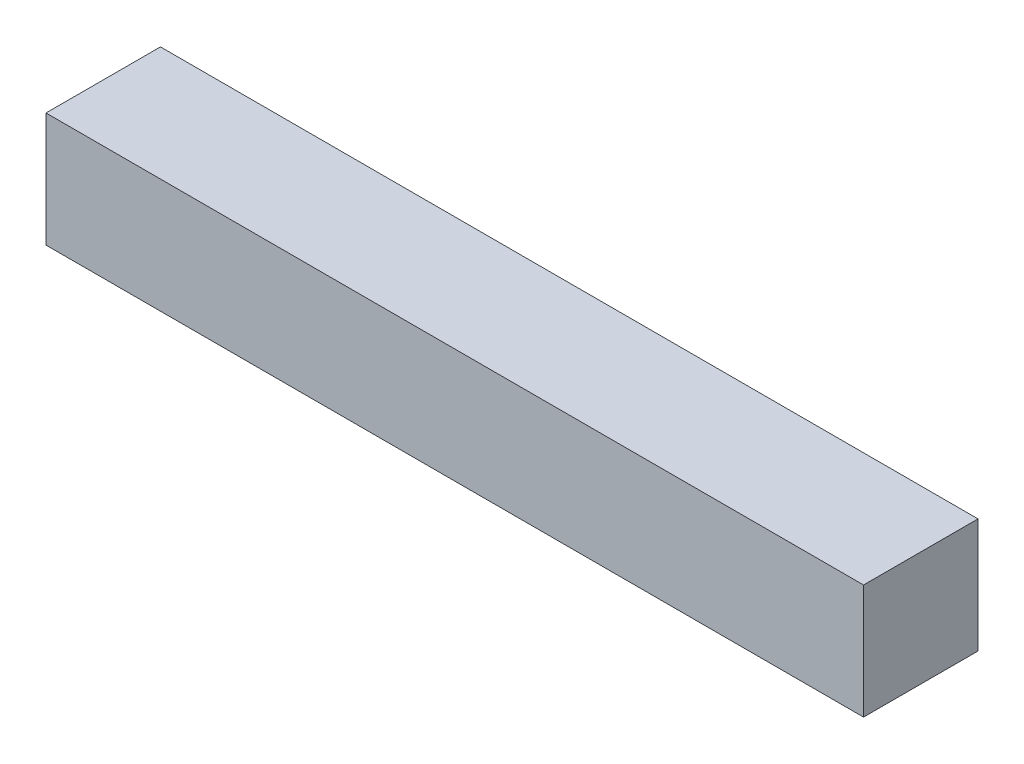
ISO-10303-21;
HEADER;
FILE_DESCRIPTION(('STEP AP214'),'2;1');
FILE_NAME('part.step','',(''),(''),'','','');
FILE_SCHEMA(('AUTOMOTIVE_DESIGN { 1 0 10303 214 1 1 1 1 }'));
ENDSEC;
DATA;
#1=APPLICATION_CONTEXT('core data for automotive mechanical design processes');
#2=APPLICATION_PROTOCOL_DEFINITION('international standard','automotive_design',2000,#1);
#3=PRODUCT_CONTEXT('',#1,'mechanical');
#4=PRODUCT('Part','Part','',(#3));
#5=PRODUCT_RELATED_PRODUCT_CATEGORY('part','',(#4));
#6=PRODUCT_DEFINITION_FORMATION('','',#4);
#7=PRODUCT_DEFINITION_CONTEXT('part definition',#1,'design');
#8=PRODUCT_DEFINITION('design','',#6,#7);
#9=PRODUCT_DEFINITION_SHAPE('','',#8);
#10=(LENGTH_UNIT() NAMED_UNIT(*) SI_UNIT(.MILLI.,.METRE.));
#11=(NAMED_UNIT(*) PLANE_ANGLE_UNIT() SI_UNIT($,.RADIAN.));
#12=(NAMED_UNIT(*) SI_UNIT($,.STERADIAN.) SOLID_ANGLE_UNIT());
#13=UNCERTAINTY_MEASURE_WITH_UNIT(LENGTH_MEASURE(1.E-05),#10,'distance_accuracy_value','');
#14=(GEOMETRIC_REPRESENTATION_CONTEXT(3) GLOBAL_UNCERTAINTY_ASSIGNED_CONTEXT((#13)) GLOBAL_UNIT_ASSIGNED_CONTEXT((#10,
#11,#12)) REPRESENTATION_CONTEXT('',''));
#15=CARTESIAN_POINT('',(0.,0.,0.));
#16=DIRECTION('',(0.,0.,1.));
#17=DIRECTION('',(1.,0.,0.));
#18=AXIS2_PLACEMENT_3D('',#15,#16,#17);
#19=CARTESIAN_POINT('',(0.,0.,0.));
#20=DIRECTION('',(0.,0.,1.));
#21=DIRECTION('',(1.,0.,0.));
#22=AXIS2_PLACEMENT_3D('',#19,#20,#21);
#23=PLANE('',#22);
#24=DIRECTION('',(0.,-1.,0.));
#25=VECTOR('',#24,1.);
#26=CARTESIAN_POINT('',(-15000.,7000.,0.));
#27=LINE('',#26,#25);
#28=CARTESIAN_POINT('',(-15000.,7000.,0.));
#29=VERTEX_POINT('',#28);
#30=CARTESIAN_POINT('',(-15000.,0.,0.));
#31=VERTEX_POINT('',#30);
#32=EDGE_CURVE('E343',#29,#31,#27,.T.);
#33=ORIENTED_EDGE('',*,*,#32,.F.);
#34=DIRECTION('',(-1.,0.,0.));
#35=VECTOR('',#34,1.);
#36=CARTESIAN_POINT('',(35000.,7000.,0.));
#37=LINE('',#36,#35);
#38=CARTESIAN_POINT('',(35000.,7000.,0.));
#39=VERTEX_POINT('',#38);
#40=EDGE_CURVE('E95',#39,#29,#37,.T.);
#41=ORIENTED_EDGE('',*,*,#40,.F.);
#42=DIRECTION('',(0.,1.,0.));
#43=VECTOR('',#42,1.);
#44=CARTESIAN_POINT('',(35000.,0.,0.));
#45=LINE('',#44,#43);
#46=CARTESIAN_POINT('',(35000.,0.,0.));
#47=VERTEX_POINT('',#46);
#48=EDGE_CURVE('E338',#47,#39,#45,.T.);
#49=ORIENTED_EDGE('',*,*,#48,.F.);
#50=DIRECTION('',(1.,0.,0.));
#51=VECTOR('',#50,1.);
#52=CARTESIAN_POINT('',(-15000.,0.,0.));
#53=LINE('',#52,#51);
#54=EDGE_CURVE('E335',#31,#47,#53,.T.);
#55=ORIENTED_EDGE('',*,*,#54,.F.);
#56=EDGE_LOOP('',(#33,#41,#49,#55));
#57=FACE_BOUND('',#56,.T.);
#58=DIRECTION('',(0.,-1.,0.));
#59=VECTOR('',#58,1.);
#60=CARTESIAN_POINT('',(99.9066587836865,800.,0.));
#61=LINE('',#60,#59);
#62=CARTESIAN_POINT('',(99.9066587836865,158.611679528378,0.));
#63=VERTEX_POINT('',#62);
#64=CARTESIAN_POINT('',(99.9066587836865,474.242430461089,0.));
#65=VERTEX_POINT('',#64);
#66=EDGE_CURVE('E11',#63,#65,#61,.F.);
#67=ORIENTED_EDGE('',*,*,#66,.F.);
#68=CARTESIAN_POINT('',(150.,300.,0.));
#69=DIRECTION('',(0.,0.,1.));
#70=DIRECTION('',(1.,0.,0.));
#71=AXIS2_PLACEMENT_3D('',#68,#69,#70);
#72=CIRCLE('',#71,150.);
#73=CARTESIAN_POINT('',(150.,150.,0.));
#74=VERTEX_POINT('',#73);
#75=EDGE_CURVE('E376',#63,#74,#72,.T.);
#76=ORIENTED_EDGE('',*,*,#75,.T.);
#77=DIRECTION('',(1.,0.,0.));
#78=VECTOR('',#77,1.);
#79=CARTESIAN_POINT('',(0.,150.,0.));
#80=LINE('',#79,#78);
#81=CARTESIAN_POINT('',(2301.451,150.,0.));
#82=VERTEX_POINT('',#81);
#83=EDGE_CURVE('E369',#74,#82,#80,.T.);
#84=ORIENTED_EDGE('',*,*,#83,.T.);
#85=DIRECTION('',(0.999048223992947,0.0436193321422773,0.));
#86=VECTOR('',#85,1.);
#87=CARTESIAN_POINT('',(-2.15782559269287,49.4223941585042,0.));
#88=LINE('',#87,#86);
#89=CARTESIAN_POINT('',(4876.20515246235,262.416051461552,0.));
#90=VERTEX_POINT('',#89);
#91=EDGE_CURVE('E368',#82,#90,#88,.T.);
#92=ORIENTED_EDGE('',*,*,#91,.T.);
#93=DIRECTION('',(0.,-1.,0.));
#94=VECTOR('',#93,1.);
#95=CARTESIAN_POINT('',(4876.20515246235,800.,0.));
#96=LINE('',#95,#94);
#97=CARTESIAN_POINT('',(4876.20515246235,300.968653089973,0.));
#98=VERTEX_POINT('',#97);
#99=EDGE_CURVE('E365',#98,#90,#96,.T.);
#100=ORIENTED_EDGE('',*,*,#99,.F.);
#101=DIRECTION('',(-0.985279818521785,0.170949346923816,0.));
#102=VECTOR('',#101,1.);
#103=CARTESIAN_POINT('',(193.193690698954,1113.48681897129,0.));
#104=LINE('',#103,#102);
#105=CARTESIAN_POINT('',(2197.056,765.81,0.));
#106=VERTEX_POINT('',#105);
#107=EDGE_CURVE('E358',#98,#106,#104,.T.);
#108=ORIENTED_EDGE('',*,*,#107,.T.);
#109=DIRECTION('',(-0.996313130885577,0.0857912887476274,0.));
#110=VECTOR('',#109,1.);
#111=CARTESIAN_POINT('',(81.6282514008476,947.96686131076,0.));
#112=LINE('',#111,#110);
#113=CARTESIAN_POINT('',(1800.,800.,0.));
#114=VERTEX_POINT('',#113);
#115=EDGE_CURVE('E357',#106,#114,#112,.T.);
#116=ORIENTED_EDGE('',*,*,#115,.T.);
#117=DIRECTION('',(1.,0.,0.));
#118=VECTOR('',#117,1.);
#119=CARTESIAN_POINT('',(0.,800.,0.));
#120=LINE('',#119,#118);
#121=CARTESIAN_POINT('',(1551.451,800.,0.));
#122=VERTEX_POINT('',#121);
#123=EDGE_CURVE('E362',#122,#114,#120,.T.);
#124=ORIENTED_EDGE('',*,*,#123,.F.);
#125=DIRECTION('',(-0.992522376322293,-0.122062821938327,0.));
#126=VECTOR('',#125,1.);
#127=CARTESIAN_POINT('',(-73.8044813669109,600.122117990456,0.));
#128=LINE('',#127,#126);
#129=CARTESIAN_POINT('',(1255.921,763.655,0.));
#130=VERTEX_POINT('',#129);
#131=EDGE_CURVE('E203',#122,#130,#128,.T.);
#132=ORIENTED_EDGE('',*,*,#131,.T.);
#133=DIRECTION('',(-0.970201590454346,-0.242299141310607,0.));
#134=VECTOR('',#133,1.);
#135=CARTESIAN_POINT('',(-105.785555519373,423.581006754064,0.));
#136=LINE('',#135,#134);
#137=CARTESIAN_POINT('',(113.655128803409,478.384348557619,0.));
#138=VERTEX_POINT('',#137);
#139=EDGE_CURVE('E373',#130,#138,#136,.T.);
#140=ORIENTED_EDGE('',*,*,#139,.T.);
#141=CARTESIAN_POINT('',(150.,332.854109989467,0.));
#142=DIRECTION('',(0.,0.,1.));
#143=DIRECTION('',(1.,0.,0.));
#144=AXIS2_PLACEMENT_3D('',#141,#142,#143);
#145=CIRCLE('',#144,150.);
#146=EDGE_CURVE('E54',#138,#65,#145,.T.);
#147=ORIENTED_EDGE('',*,*,#146,.T.);
#148=EDGE_LOOP('',(#67,#76,#84,#92,#100,#108,#116,#124,#132,#140,#147));
#149=FACE_BOUND('',#148,.T.);
#150=ADVANCED_FACE('F50',(#57,#149),#23,.F.);
#151=CARTESIAN_POINT('',(-15000.,7000.,7000.));
#152=DIRECTION('',(1.,0.,0.));
#153=DIRECTION('',(0.,0.,-1.));
#154=AXIS2_PLACEMENT_3D('',#151,#152,#153);
#155=PLANE('',#154);
#156=ORIENTED_EDGE('',*,*,#32,.T.);
#157=DIRECTION('',(0.,0.,-1.));
#158=VECTOR('',#157,1.);
#159=CARTESIAN_POINT('',(-15000.,0.,7000.));
#160=LINE('',#159,#158);
#161=CARTESIAN_POINT('',(-15000.,0.,7000.));
#162=VERTEX_POINT('',#161);
#163=EDGE_CURVE('E340',#162,#31,#160,.T.);
#164=ORIENTED_EDGE('',*,*,#163,.F.);
#165=DIRECTION('',(0.,-1.,0.));
#166=VECTOR('',#165,1.);
#167=CARTESIAN_POINT('',(-15000.,7000.,7000.));
#168=LINE('',#167,#166);
#169=CARTESIAN_POINT('',(-15000.,7000.,7000.));
#170=VERTEX_POINT('',#169);
#171=EDGE_CURVE('E346',#170,#162,#168,.T.);
#172=ORIENTED_EDGE('',*,*,#171,.F.);
#173=DIRECTION('',(0.,0.,-1.));
#174=VECTOR('',#173,1.);
#175=CARTESIAN_POINT('',(-15000.,7000.,7000.));
#176=LINE('',#175,#174);
#177=EDGE_CURVE('E355',#170,#29,#176,.T.);
#178=ORIENTED_EDGE('',*,*,#177,.T.);
#179=EDGE_LOOP('',(#156,#164,#172,#178));
#180=FACE_BOUND('',#179,.T.);
#181=ADVANCED_FACE('F47',(#180),#155,.F.);
#182=CARTESIAN_POINT('',(-15000.,0.,7000.));
#183=DIRECTION('',(0.,1.,0.));
#184=DIRECTION('',(0.,0.,1.));
#185=AXIS2_PLACEMENT_3D('',#182,#183,#184);
#186=PLANE('',#185);
#187=ORIENTED_EDGE('',*,*,#54,.T.);
#188=DIRECTION('',(0.,0.,-1.));
#189=VECTOR('',#188,1.);
#190=CARTESIAN_POINT('',(35000.,0.,7000.));
#191=LINE('',#190,#189);
#192=CARTESIAN_POINT('',(35000.,0.,7000.));
#193=VERTEX_POINT('',#192);
#194=EDGE_CURVE('E331',#193,#47,#191,.T.);
#195=ORIENTED_EDGE('',*,*,#194,.F.);
#196=DIRECTION('',(1.,0.,0.));
#197=VECTOR('',#196,1.);
#198=CARTESIAN_POINT('',(-15000.,0.,7000.));
#199=LINE('',#198,#197);
#200=EDGE_CURVE('E99',#162,#193,#199,.T.);
#201=ORIENTED_EDGE('',*,*,#200,.F.);
#202=ORIENTED_EDGE('',*,*,#163,.T.);
#203=EDGE_LOOP('',(#187,#195,#201,#202));
#204=FACE_BOUND('',#203,.T.);
#205=ADVANCED_FACE('F320',(#204),#186,.F.);
#206=CARTESIAN_POINT('',(35000.,0.,7000.));
#207=DIRECTION('',(-1.,0.,0.));
#208=DIRECTION('',(0.,0.,1.));
#209=AXIS2_PLACEMENT_3D('',#206,#207,#208);
#210=PLANE('',#209);
#211=ORIENTED_EDGE('',*,*,#48,.T.);
#212=DIRECTION('',(0.,0.,-1.));
#213=VECTOR('',#212,1.);
#214=CARTESIAN_POINT('',(35000.,7000.,7000.));
#215=LINE('',#214,#213);
#216=CARTESIAN_POINT('',(35000.,7000.,7000.));
#217=VERTEX_POINT('',#216);
#218=EDGE_CURVE('E344',#217,#39,#215,.T.);
#219=ORIENTED_EDGE('',*,*,#218,.F.);
#220=DIRECTION('',(0.,1.,0.));
#221=VECTOR('',#220,1.);
#222=CARTESIAN_POINT('',(35000.,0.,7000.));
#223=LINE('',#222,#221);
#224=EDGE_CURVE('E342',#193,#217,#223,.T.);
#225=ORIENTED_EDGE('',*,*,#224,.F.);
#226=ORIENTED_EDGE('',*,*,#194,.T.);
#227=EDGE_LOOP('',(#211,#219,#225,#226));
#228=FACE_BOUND('',#227,.T.);
#229=ADVANCED_FACE('F326',(#228),#210,.F.);
#230=CARTESIAN_POINT('',(35000.,7000.,7000.));
#231=DIRECTION('',(0.,-1.,0.));
#232=DIRECTION('',(0.,0.,-1.));
#233=AXIS2_PLACEMENT_3D('',#230,#231,#232);
#234=PLANE('',#233);
#235=ORIENTED_EDGE('',*,*,#40,.T.);
#236=ORIENTED_EDGE('',*,*,#177,.F.);
#237=DIRECTION('',(-1.,0.,0.));
#238=VECTOR('',#237,1.);
#239=CARTESIAN_POINT('',(35000.,7000.,7000.));
#240=LINE('',#239,#238);
#241=EDGE_CURVE('E72',#217,#170,#240,.T.);
#242=ORIENTED_EDGE('',*,*,#241,.F.);
#243=ORIENTED_EDGE('',*,*,#218,.T.);
#244=EDGE_LOOP('',(#235,#236,#242,#243));
#245=FACE_BOUND('',#244,.T.);
#246=ADVANCED_FACE('F323',(#245),#234,.F.);
#247=CARTESIAN_POINT('',(0.,0.,7000.));
#248=DIRECTION('',(0.,0.,1.));
#249=DIRECTION('',(1.,0.,0.));
#250=AXIS2_PLACEMENT_3D('',#247,#248,#249);
#251=PLANE('',#250);
#252=ORIENTED_EDGE('',*,*,#171,.T.);
#253=ORIENTED_EDGE('',*,*,#200,.T.);
#254=ORIENTED_EDGE('',*,*,#224,.T.);
#255=ORIENTED_EDGE('',*,*,#241,.T.);
#256=EDGE_LOOP('',(#252,#253,#254,#255));
#257=FACE_BOUND('',#256,.T.);
#258=ADVANCED_FACE('F325',(#257),#251,.T.);
#259=CARTESIAN_POINT('',(259.906658783687,800.,0.));
#260=DIRECTION('',(0.,-1.,0.));
#261=DIRECTION('',(0.,0.,-1.));
#262=AXIS2_PLACEMENT_3D('',#259,#260,#261);
#263=CYLINDRICAL_SURFACE('',#262,160.);
#264=ORIENTED_EDGE('',*,*,#66,.T.);
#265=CARTESIAN_POINT('',(113.655128803409,478.384348557619,-64.8882884535263));
#266=CARTESIAN_POINT('',(112.773939032918,478.164232994411,-62.9022135519065));
#267=CARTESIAN_POINT('',(111.933155729284,477.945795953748,-60.8980057661391));
#268=CARTESIAN_POINT('',(110.333625202495,477.516710712539,-56.8562236105316));
#269=CARTESIAN_POINT('',(109.574880662755,477.306062766917,-54.8186481517733));
#270=CARTESIAN_POINT('',(108.140474526136,476.896935722458,-50.7124900371555));
#271=CARTESIAN_POINT('',(107.464840130629,476.698460618308,-48.6438974768202));
#272=CARTESIAN_POINT('',(106.198137658814,476.317814583302,-44.4795123289952));
#273=CARTESIAN_POINT('',(105.607068680471,476.135643478542,-42.383720031898));
#274=CARTESIAN_POINT('',(104.511164120193,475.791492586405,-38.170326894472));
#275=CARTESIAN_POINT('',(104.006242210099,475.629492630005,-36.0527501682852));
#276=CARTESIAN_POINT('',(103.082932209994,475.328755377082,-31.7971598743901));
#277=CARTESIAN_POINT('',(102.66454431668,475.190018133439,-29.6591462602389));
#278=CARTESIAN_POINT('',(101.915268820844,474.938644041753,-25.3666448290491));
#279=CARTESIAN_POINT('',(101.58436782491,474.826003198927,-23.2121595856826));
#280=CARTESIAN_POINT('',(101.010740244002,474.629088177567,-18.8901866979926));
#281=CARTESIAN_POINT('',(100.768013552683,474.544813964819,-16.7226990693543));
#282=CARTESIAN_POINT('',(100.37076423608,474.406161867699,-12.3726224328995));
#283=CARTESIAN_POINT('',(100.21648827366,474.351867603903,-10.1900082088244));
#284=CARTESIAN_POINT('',(99.9975671230742,474.274653761924,-5.8197269539753));
#285=CARTESIAN_POINT('',(99.9329221235669,474.251734249778,-3.6320599125758));
#286=CARTESIAN_POINT('',(99.8934242819721,474.237742403755,0.744450738233998));
#287=CARTESIAN_POINT('',(99.9185822486834,474.246673903504,2.93329445756778));
#288=CARTESIAN_POINT('',(100.058650209219,474.296207977458,7.30773390133307));
#289=CARTESIAN_POINT('',(100.173559683034,474.336810368165,9.49332964450949));
#290=CARTESIAN_POINT('',(100.492693380218,474.448796061191,13.8551440212282));
#291=CARTESIAN_POINT('',(100.696834271621,474.520150643601,16.0313694952312));
#292=CARTESIAN_POINT('',(101.193919943739,474.692171407193,20.3725274347643));
#293=CARTESIAN_POINT('',(101.486866629951,474.792838217323,22.5374596569623));
#294=CARTESIAN_POINT('',(102.16078590948,475.021392150112,26.8515295793954));
#295=CARTESIAN_POINT('',(102.541734866669,475.149271963028,29.0006713610749));
#296=CARTESIAN_POINT('',(103.390811659426,475.429645345374,33.2798357862657));
#297=CARTESIAN_POINT('',(103.8589325439,475.582136952128,35.4098599400322));
#298=CARTESIAN_POINT('',(104.936939869616,475.926381416005,39.8776210107061));
#299=CARTESIAN_POINT('',(105.556701493798,476.120599632764,42.2127912998076));
#300=CARTESIAN_POINT('',(106.900536974426,476.5305848942,46.8503359801782));
#301=CARTESIAN_POINT('',(107.624586121608,476.746346830732,49.1527179985066));
#302=CARTESIAN_POINT('',(109.174416422244,477.193713901137,53.7177097487012));
#303=CARTESIAN_POINT('',(110.000046911566,477.425295350108,55.9803728286771));
#304=CARTESIAN_POINT('',(111.314153213711,477.78033591011,59.3440574899915));
#305=CARTESIAN_POINT('',(111.764862264654,477.899976882307,60.4603772225236));
#306=CARTESIAN_POINT('',(112.691287391964,478.141029180627,62.6823991134769));
#307=CARTESIAN_POINT('',(113.167003475438,478.262440507252,63.7881012688804));
#308=CARTESIAN_POINT('',(113.655128803409,478.384348557619,64.8882884535263));
#309=B_SPLINE_CURVE_WITH_KNOTS('',3,(#265,#266,#267,#268,#269,#270,#271,#272,#273,#274,#275,
#276,#277,#278,#279,#280,#281,#282,#283,#284,#285,#286,#287,#288,#289,#290,#291,#292,#293,#294,
#295,#296,#297,#298,#299,#300,#301,#302,#303,#304,#305,#306,#307,#308),.UNSPECIFIED.,.F.,.F.,(4,
2,2,2,2,2,2,2,2,2,2,2,2,2,2,2,2,2,2,2,2,4),(0.,6.55129299468972,13.1028002115112,
19.6564460177392,26.2100219127685,32.7569913826109,39.3039757340479,45.849957223369,
52.3959308176641,58.9600714939326,65.5242259865694,72.089170575798,78.6540771287231,
85.2128658627705,91.7717953380148,98.3289652243589,104.885612465355,112.154383970393,
119.421436080517,126.677836867381,130.306981102657,133.936126369311),.UNSPECIFIED.);
#310=CARTESIAN_POINT('',(113.655128803409,478.384348557619,64.8882884535251));
#311=VERTEX_POINT('',#310);
#312=EDGE_CURVE('E243',#65,#311,#309,.T.);
#313=ORIENTED_EDGE('',*,*,#312,.T.);
#314=CARTESIAN_POINT('',(259.906658783687,514.909355812027,0.));
#315=DIRECTION('',(-0.242299141310607,0.970201590454346,0.));
#316=DIRECTION('',(-0.970201590454346,-0.242299141310607,0.));
#317=AXIS2_PLACEMENT_3D('',#314,#315,#316);
#318=ELLIPSE('',#317,164.914180283988,160.);
#319=CARTESIAN_POINT('',(161.409759474517,490.310639051325,126.088702215857));
#320=VERTEX_POINT('',#319);
#321=EDGE_CURVE('E384',#311,#320,#318,.T.);
#322=ORIENTED_EDGE('',*,*,#321,.T.);
#323=DIRECTION('',(0.,-1.,0.));
#324=VECTOR('',#323,1.);
#325=CARTESIAN_POINT('',(161.409759474516,800.,126.088702215857));
#326=LINE('',#325,#324);
#327=CARTESIAN_POINT('',(161.409759474516,150.,126.088702215857));
#328=VERTEX_POINT('',#327);
#329=EDGE_CURVE('E245',#320,#328,#326,.T.);
#330=ORIENTED_EDGE('',*,*,#329,.T.);
#331=CARTESIAN_POINT('',(259.906658783687,150.,0.));
#332=DIRECTION('',(0.,-1.,0.));
#333=DIRECTION('',(0.,0.,-1.));
#334=AXIS2_PLACEMENT_3D('',#331,#332,#333);
#335=CIRCLE('',#334,160.);
#336=CARTESIAN_POINT('',(150.,150.,116.277798203296));
#337=VERTEX_POINT('',#336);
#338=EDGE_CURVE('E401',#328,#337,#335,.T.);
#339=ORIENTED_EDGE('',*,*,#338,.T.);
#340=CARTESIAN_POINT('',(150.,150.,116.277798203296));
#341=CARTESIAN_POINT('',(149.197227518988,150.000000444739,115.519013001234));
#342=CARTESIAN_POINT('',(148.402349323817,150.006444551494,114.751945115754));
#343=CARTESIAN_POINT('',(146.828761077162,150.031461689993,113.201629596887));
#344=CARTESIAN_POINT('',(146.050050642098,150.050034433644,112.418382348238));
#345=CARTESIAN_POINT('',(143.738992605803,150.122798834219,110.045212540939));
#346=CARTESIAN_POINT('',(142.231396084721,150.194037269926,108.43155736251));
#347=CARTESIAN_POINT('',(139.286546373212,150.375814699117,105.145862331909));
#348=CARTESIAN_POINT('',(137.849239225862,150.486322991144,103.473869007217));
#349=CARTESIAN_POINT('',(135.046053340973,150.740627964951,100.073395601841));
#350=CARTESIAN_POINT('',(133.68017721911,150.884425864692,98.3449134563993));
#351=CARTESIAN_POINT('',(131.023003065829,151.199252798717,94.8358771461094));
#352=CARTESIAN_POINT('',(129.731654200361,151.37026296545,93.0553597529595));
#353=CARTESIAN_POINT('',(127.224251842487,151.733785604688,89.4439038255723));
#354=CARTESIAN_POINT('',(126.008207640174,151.926300722009,87.6129591103741));
#355=CARTESIAN_POINT('',(123.653075843413,152.327163170553,83.903449669022));
#356=CARTESIAN_POINT('',(122.514002675644,152.535513454298,82.0248761060328));
#357=CARTESIAN_POINT('',(120.314753352958,152.962451132073,78.2235331504458));
#358=CARTESIAN_POINT('',(119.254568306852,153.181037367909,76.3007687705009));
#359=CARTESIAN_POINT('',(117.216364660646,153.622684269366,72.4173979297617));
#360=CARTESIAN_POINT('',(116.238193444443,153.84573562226,70.4568704991598));
#361=CARTESIAN_POINT('',(114.363161419552,154.291577394139,66.4972847107507));
#362=CARTESIAN_POINT('',(113.466300511938,154.514367813441,64.4982263998262));
#363=CARTESIAN_POINT('',(111.755279479412,154.954759642745,60.464600680722));
#364=CARTESIAN_POINT('',(110.941114441265,155.172361360436,58.4300353905561));
#365=CARTESIAN_POINT('',(109.396721623774,155.597730716471,54.3282724139933));
#366=CARTESIAN_POINT('',(108.666493845211,155.805498354724,52.2610747272926));
#367=CARTESIAN_POINT('',(107.291517437633,156.206751675774,48.0980446572108));
#368=CARTESIAN_POINT('',(106.646732773703,156.400243363975,46.0022247590141));
#369=CARTESIAN_POINT('',(105.443470641596,156.769026649784,41.784363149105));
#370=CARTESIAN_POINT('',(104.884993033115,156.944318276979,39.6623214800257));
#371=CARTESIAN_POINT('',(103.855447732851,157.273084547455,35.3954250788466));
#372=CARTESIAN_POINT('',(103.384381074604,157.426558932767,33.2505700773215));
#373=CARTESIAN_POINT('',(102.530668116976,157.708522147084,28.9416891731522));
#374=CARTESIAN_POINT('',(102.148022100941,157.837010896023,26.7776632090972));
#375=CARTESIAN_POINT('',(101.465667462759,158.068499170636,22.3934355301932));
#376=CARTESIAN_POINT('',(101.16765188495,158.170974528566,20.1729421971747));
#377=CARTESIAN_POINT('',(100.665032437988,158.345025688778,15.7201891996206));
#378=CARTESIAN_POINT('',(100.460428869546,158.416601391587,13.4879294972302));
#379=CARTESIAN_POINT('',(100.145158117363,158.527307591484,9.01595322708888));
#380=CARTESIAN_POINT('',(100.034491923749,158.566437746585,6.77623658098935));
#381=CARTESIAN_POINT('',(99.9073913706489,158.611403854638,2.29379848782876));
#382=CARTESIAN_POINT('',(99.890956852716,158.617239863573,0.0510770458265141));
#383=CARTESIAN_POINT('',(99.9523649444744,158.595490600866,-4.43306367901725));
#384=CARTESIAN_POINT('',(100.030213962676,158.567903057404,-6.67448286298269));
#385=CARTESIAN_POINT('',(100.279994263522,158.479900598214,-11.1514286514722));
#386=CARTESIAN_POINT('',(100.45192582509,158.419485585163,-13.3869552385069));
#387=CARTESIAN_POINT('',(100.889419452544,158.267136953808,-17.8476868417839));
#388=CARTESIAN_POINT('',(101.154979400206,158.175204048558,-20.0728920903795));
#389=CARTESIAN_POINT('',(101.779063595891,157.961800844771,-24.5087784389172));
#390=CARTESIAN_POINT('',(102.137587017684,157.840330808752,-26.7194596677651));
#391=CARTESIAN_POINT('',(102.926775780276,157.577123600622,-31.013612685877));
#392=CARTESIAN_POINT('',(103.353010132429,157.436681731273,-33.097980323524));
#393=CARTESIAN_POINT('',(104.287844992139,157.134188084224,-37.2465553021806));
#394=CARTESIAN_POINT('',(104.796444743854,156.972136504832,-39.3107628280093));
#395=CARTESIAN_POINT('',(105.895018848793,156.629565097021,-43.4157709760835));
#396=CARTESIAN_POINT('',(106.484990458811,156.449045891235,-45.4565723848841));
#397=CARTESIAN_POINT('',(107.745269602171,156.073038938233,-49.5118169088477));
#398=CARTESIAN_POINT('',(108.415577358716,155.87755114943,-51.5262599507604));
#399=CARTESIAN_POINT('',(109.835448832084,155.475423435206,-55.5259909350783));
#400=CARTESIAN_POINT('',(110.585016389714,155.268782969582,-57.5112774592899));
#401=CARTESIAN_POINT('',(112.16222299892,154.848463183412,-61.4498304520931));
#402=CARTESIAN_POINT('',(112.989862077777,154.634783860406,-63.4030969094955));
#403=CARTESIAN_POINT('',(114.722056314859,154.204722154663,-67.2750290342799));
#404=CARTESIAN_POINT('',(115.626615162842,153.988339642681,-69.1936930364625));
#405=CARTESIAN_POINT('',(117.511377819577,153.557438268491,-72.9937124329084));
#406=CARTESIAN_POINT('',(118.491581457163,153.342919402067,-74.8750679115794));
#407=CARTESIAN_POINT('',(120.50777368734,152.924342060301,-78.5639102097275));
#408=CARTESIAN_POINT('',(121.542417530248,152.72016412512,-80.3721185349167));
#409=CARTESIAN_POINT('',(123.682199302699,152.32279256364,-83.9478298250324));
#410=CARTESIAN_POINT('',(124.787344283253,152.129600039689,-85.71532869436));
#411=CARTESIAN_POINT('',(127.066448812287,151.759031112758,-89.2066346063971));
#412=CARTESIAN_POINT('',(128.240395586125,151.581651789015,-90.93044967541));
#413=CARTESIAN_POINT('',(130.655656175891,151.247580067016,-94.3320138856591));
#414=CARTESIAN_POINT('',(131.896962496124,151.090885373631,-96.0097681213311));
#415=CARTESIAN_POINT('',(134.446592080053,150.803019950715,-99.3183641400926));
#416=CARTESIAN_POINT('',(135.754977031146,150.671873267667,-100.949160506855));
#417=CARTESIAN_POINT('',(138.435759352656,150.44038541193,-104.159463428637));
#418=CARTESIAN_POINT('',(139.80815467633,150.340043255038,-105.73897162087));
#419=CARTESIAN_POINT('',(142.615869629206,150.1752575045,-108.845099188879));
#420=CARTESIAN_POINT('',(144.051233647806,150.110839688822,-110.371679851087));
#421=CARTESIAN_POINT('',(146.981580403563,150.023207631752,-113.368082399426));
#422=CARTESIAN_POINT('',(148.476570551277,149.999998528351,-114.83789718552));
#423=CARTESIAN_POINT('',(150.,150.,-116.277798203296));
#424=B_SPLINE_CURVE_WITH_KNOTS('',3,(#340,#341,#342,#343,#344,#345,#346,#347,#348,#349,#350,
#351,#352,#353,#354,#355,#356,#357,#358,#359,#360,#361,#362,#363,#364,#365,#366,#367,#368,#369,
#370,#371,#372,#373,#374,#375,#376,#377,#378,#379,#380,#381,#382,#383,#384,#385,#386,#387,#388,
#389,#390,#391,#392,#393,#394,#395,#396,#397,#398,#399,#400,#401,#402,#403,#404,#405,#406,#407,
#408,#409,#410,#411,#412,#413,#414,#415,#416,#417,#418,#419,#420,#421,#422,#423),.UNSPECIFIED.,
.F.,.F.,(4,2,2,2,2,2,2,2,2,2,2,2,2,2,2,2,2,2,2,2,2,2,2,2,2,2,2,2,2,2,2,2,2,2,2,2,2,2,2,2,2,4),
(0.,3.31371001652165,6.6273413252176,13.2532751900694,19.8740402078589,26.4950474965277,
33.1114839710399,39.7287350744754,46.3472230285733,52.9649639039089,59.5701033647869,
66.1752347893612,72.7799735513195,79.3847123747196,85.9866567792438,92.5885904512923,
99.1906021788814,105.792635062468,112.518689760155,119.244766110194,125.970913354141,
132.697049288266,139.42364242767,146.150255509359,152.876716419738,159.6031175495,
165.997719115792,172.392262004002,178.786589372256,185.180934506686,191.57558964331,
197.970247014477,204.365211303699,210.760161123149,217.03838877844,223.317245323713,
229.594939724959,235.871936978217,242.154814065331,248.437490393972,254.72466915517,
261.012631760361),.UNSPECIFIED.);
#425=EDGE_CURVE('E255',#337,#63,#424,.T.);
#426=ORIENTED_EDGE('',*,*,#425,.T.);
#427=EDGE_LOOP('',(#264,#313,#322,#330,#339,#426));
#428=FACE_BOUND('',#427,.T.);
#429=ADVANCED_FACE('F261',(#428),#263,.F.);
#430=CARTESIAN_POINT('',(4846.20515246235,800.,0.));
#431=DIRECTION('',(0.,-1.,0.));
#432=DIRECTION('',(0.,0.,-1.));
#433=AXIS2_PLACEMENT_3D('',#430,#431,#432);
#434=CYLINDRICAL_SURFACE('',#433,30.);
#435=ORIENTED_EDGE('',*,*,#99,.T.);
#436=CARTESIAN_POINT('',(4846.20515246235,261.106224835727,0.));
#437=DIRECTION('',(0.0436193321422773,-0.999048223992947,0.));
#438=DIRECTION('',(-0.999048223992947,-0.0436193321422773,0.));
#439=AXIS2_PLACEMENT_3D('',#436,#437,#438);
#440=ELLIPSE('',#439,30.0285804824292,30.);
#441=CARTESIAN_POINT('',(4854.87610310538,261.484806236509,28.719585911815));
#442=VERTEX_POINT('',#441);
#443=EDGE_CURVE('E414',#90,#442,#440,.T.);
#444=ORIENTED_EDGE('',*,*,#443,.T.);
#445=DIRECTION('',(0.,-1.,0.));
#446=VECTOR('',#445,1.);
#447=CARTESIAN_POINT('',(4854.87610310538,800.,28.719585911815));
#448=LINE('',#447,#446);
#449=CARTESIAN_POINT('',(4854.87610310538,304.669314556428,28.719585911815));
#450=VERTEX_POINT('',#449);
#451=EDGE_CURVE('E218',#450,#442,#448,.T.);
#452=ORIENTED_EDGE('',*,*,#451,.F.);
#453=CARTESIAN_POINT('',(4846.20515246235,306.173753520639,0.));
#454=DIRECTION('',(0.170949346923816,0.985279818521785,0.));
#455=DIRECTION('',(0.985279818521785,-0.170949346923816,0.));
#456=AXIS2_PLACEMENT_3D('',#453,#454,#455);
#457=ELLIPSE('',#456,30.448203074949,30.);
#458=EDGE_CURVE('E425',#450,#98,#457,.T.);
#459=ORIENTED_EDGE('',*,*,#458,.T.);
#460=EDGE_LOOP('',(#435,#444,#452,#459));
#461=FACE_BOUND('',#460,.T.);
#462=ADVANCED_FACE('F285',(#461),#434,.F.);
#463=CARTESIAN_POINT('',(4846.20515246235,800.,0.));
#464=DIRECTION('',(0.,-1.,0.));
#465=DIRECTION('',(0.,0.,-1.));
#466=AXIS2_PLACEMENT_3D('',#463,#464,#465);
#467=PLANE('',#466);
#468=ORIENTED_EDGE('',*,*,#123,.T.);
#469=DIRECTION('',(0.,0.,1.));
#470=VECTOR('',#469,1.);
#471=CARTESIAN_POINT('',(1800.,800.,-800.));
#472=LINE('',#471,#470);
#473=CARTESIAN_POINT('',(1800.,800.,800.));
#474=VERTEX_POINT('',#473);
#475=EDGE_CURVE('E206',#114,#474,#472,.T.);
#476=ORIENTED_EDGE('',*,*,#475,.T.);
#477=DIRECTION('',(1.,0.,0.));
#478=VECTOR('',#477,1.);
#479=CARTESIAN_POINT('',(1997.019,800.,800.));
#480=LINE('',#479,#478);
#481=CARTESIAN_POINT('',(1551.451,800.,800.));
#482=VERTEX_POINT('',#481);
#483=EDGE_CURVE('E211',#482,#474,#480,.T.);
#484=ORIENTED_EDGE('',*,*,#483,.F.);
#485=DIRECTION('',(0.,0.,1.));
#486=VECTOR('',#485,1.);
#487=CARTESIAN_POINT('',(1551.451,800.,-800.));
#488=LINE('',#487,#486);
#489=EDGE_CURVE('E191',#122,#482,#488,.T.);
#490=ORIENTED_EDGE('',*,*,#489,.F.);
#491=EDGE_LOOP('',(#468,#476,#484,#490));
#492=FACE_BOUND('',#491,.T.);
#493=ADVANCED_FACE('F216',(#492),#467,.T.);
#494=CARTESIAN_POINT('',(113.655128803409,478.384348557619,-800.));
#495=DIRECTION('',(-0.242299141310607,0.970201590454346,0.));
#496=DIRECTION('',(-0.970201590454346,-0.242299141310607,0.));
#497=AXIS2_PLACEMENT_3D('',#494,#495,#496);
#498=PLANE('',#497);
#499=DIRECTION('',(0.,0.,1.));
#500=VECTOR('',#499,1.);
#501=CARTESIAN_POINT('',(1255.921,763.655,-800.));
#502=LINE('',#501,#500);
#503=CARTESIAN_POINT('',(1255.921,763.655,774.339123964959));
#504=VERTEX_POINT('',#503);
#505=EDGE_CURVE('E390',#130,#504,#502,.T.);
#506=ORIENTED_EDGE('',*,*,#505,.T.);
#507=DIRECTION('',(0.956308883695465,0.238829562460936,0.168623127298276));
#508=VECTOR('',#507,1.);
#509=CARTESIAN_POINT('',(1401.45104302585,799.999822361657,800.000007586622));
#510=LINE('',#509,#508);
#511=CARTESIAN_POINT('',(1076.464,718.837224570654,742.696));
#512=VERTEX_POINT('',#511);
#513=EDGE_CURVE('E202',#512,#504,#510,.T.);
#514=ORIENTED_EDGE('',*,*,#513,.F.);
#515=DIRECTION('',(0.890658508940707,0.222433970466134,0.396548293697232));
#516=VECTOR('',#515,1.);
#517=CARTESIAN_POINT('',(1092.5433772675,722.852904758212,749.85502846617));
#518=LINE('',#517,#516);
#519=CARTESIAN_POINT('',(784.13,645.82943126996,612.54));
#520=VERTEX_POINT('',#519);
#521=EDGE_CURVE('E399',#520,#512,#518,.T.);
#522=ORIENTED_EDGE('',*,*,#521,.F.);
#523=DIRECTION('',(0.773221678679863,0.193105175903845,0.604018730387262));
#524=VECTOR('',#523,1.);
#525=CARTESIAN_POINT('',(807.149686821474,651.578391491176,630.522323040345));
#526=LINE('',#525,#524);
#527=EDGE_CURVE('E400',#320,#520,#526,.T.);
#528=ORIENTED_EDGE('',*,*,#527,.F.);
#529=ORIENTED_EDGE('',*,*,#321,.F.);
#530=DIRECTION('',(0.,0.,1.));
#531=VECTOR('',#530,1.);
#532=CARTESIAN_POINT('',(113.655128803409,478.384348557619,-800.));
#533=LINE('',#532,#531);
#534=EDGE_CURVE('E385',#138,#311,#533,.T.);
#535=ORIENTED_EDGE('',*,*,#534,.F.);
#536=ORIENTED_EDGE('',*,*,#139,.F.);
#537=EDGE_LOOP('',(#506,#514,#522,#528,#529,#535,#536));
#538=FACE_BOUND('',#537,.T.);
#539=ADVANCED_FACE('F273',(#538),#498,.F.);
#540=CARTESIAN_POINT('',(1255.921,763.655,-800.));
#541=DIRECTION('',(-0.122062821938327,0.992522376322293,0.));
#542=DIRECTION('',(-0.992522376322293,-0.122062821938327,0.));
#543=AXIS2_PLACEMENT_3D('',#540,#541,#542);
#544=PLANE('',#543);
#545=ORIENTED_EDGE('',*,*,#489,.T.);
#546=DIRECTION('',(-0.992522376322293,-0.122062821938327,0.));
#547=VECTOR('',#546,1.);
#548=CARTESIAN_POINT('',(1255.921,763.655,800.));
#549=LINE('',#548,#547);
#550=CARTESIAN_POINT('',(1401.451,781.55263425033,800.));
#551=VERTEX_POINT('',#550);
#552=EDGE_CURVE('E197',#482,#551,#549,.T.);
#553=ORIENTED_EDGE('',*,*,#552,.T.);
#554=DIRECTION('',(0.977663361324776,0.120235424042734,0.172388499408761));
#555=VECTOR('',#554,1.);
#556=CARTESIAN_POINT('',(1403.61948357921,781.819319648382,800.382362319179));
#557=LINE('',#556,#555);
#558=EDGE_CURVE('E407',#504,#551,#557,.T.);
#559=ORIENTED_EDGE('',*,*,#558,.F.);
#560=ORIENTED_EDGE('',*,*,#505,.F.);
#561=ORIENTED_EDGE('',*,*,#131,.F.);
#562=EDGE_LOOP('',(#545,#553,#559,#560,#561));
#563=FACE_BOUND('',#562,.T.);
#564=ADVANCED_FACE('F194',(#563),#544,.F.);
#565=CARTESIAN_POINT('',(150.,332.854109989467,-800.));
#566=DIRECTION('',(0.,0.,1.));
#567=DIRECTION('',(1.,0.,0.));
#568=AXIS2_PLACEMENT_3D('',#565,#566,#567);
#569=CYLINDRICAL_SURFACE('',#568,150.);
#570=ORIENTED_EDGE('',*,*,#534,.T.);
#571=ORIENTED_EDGE('',*,*,#312,.F.);
#572=ORIENTED_EDGE('',*,*,#146,.F.);
#573=EDGE_LOOP('',(#570,#571,#572));
#574=FACE_BOUND('',#573,.T.);
#575=ADVANCED_FACE('F264',(#574),#569,.F.);
#576=CARTESIAN_POINT('',(2301.451,150.,-800.));
#577=DIRECTION('',(0.,-1.,0.));
#578=DIRECTION('',(0.,0.,-1.));
#579=AXIS2_PLACEMENT_3D('',#576,#577,#578);
#580=PLANE('',#579);
#581=DIRECTION('',(0.,0.,1.));
#582=VECTOR('',#581,1.);
#583=CARTESIAN_POINT('',(150.,150.,-800.));
#584=LINE('',#583,#582);
#585=EDGE_CURVE('E387',#74,#337,#584,.T.);
#586=ORIENTED_EDGE('',*,*,#585,.T.);
#587=ORIENTED_EDGE('',*,*,#338,.F.);
#588=DIRECTION('',(-0.788054388849103,0.,-0.615605620682322));
#589=VECTOR('',#588,1.);
#590=CARTESIAN_POINT('',(784.13,150.,612.54));
#591=LINE('',#590,#589);
#592=CARTESIAN_POINT('',(784.13,150.,612.54));
#593=VERTEX_POINT('',#592);
#594=EDGE_CURVE('E410',#593,#328,#591,.T.);
#595=ORIENTED_EDGE('',*,*,#594,.F.);
#596=DIRECTION('',(-0.913544856728147,0.,-0.406737992749078));
#597=VECTOR('',#596,1.);
#598=CARTESIAN_POINT('',(1076.464,150.,742.696));
#599=LINE('',#598,#597);
#600=CARTESIAN_POINT('',(1076.464,150.,742.696));
#601=VERTEX_POINT('',#600);
#602=EDGE_CURVE('E413',#601,#593,#599,.T.);
#603=ORIENTED_EDGE('',*,*,#602,.F.);
#604=DIRECTION('',(-0.98480774082361,0.,-0.173648246791891));
#605=VECTOR('',#604,1.);
#606=CARTESIAN_POINT('',(1401.451,150.,800.));
#607=LINE('',#606,#605);
#608=CARTESIAN_POINT('',(1401.451,150.,800.));
#609=VERTEX_POINT('',#608);
#610=EDGE_CURVE('E406',#609,#601,#607,.T.);
#611=ORIENTED_EDGE('',*,*,#610,.F.);
#612=DIRECTION('',(1.,0.,0.));
#613=VECTOR('',#612,1.);
#614=CARTESIAN_POINT('',(2301.451,150.,800.));
#615=LINE('',#614,#613);
#616=CARTESIAN_POINT('',(1997.019,150.,800.));
#617=VERTEX_POINT('',#616);
#618=EDGE_CURVE('E212',#609,#617,#615,.T.);
#619=ORIENTED_EDGE('',*,*,#618,.T.);
#620=DIRECTION('',(-0.989272274699699,0.,0.146083423120088));
#621=VECTOR('',#620,1.);
#622=CARTESIAN_POINT('',(2590.582,150.,712.35));
#623=LINE('',#622,#621);
#624=CARTESIAN_POINT('',(2301.451,150.,755.045269331141));
#625=VERTEX_POINT('',#624);
#626=EDGE_CURVE('E398',#625,#617,#623,.T.);
#627=ORIENTED_EDGE('',*,*,#626,.F.);
#628=DIRECTION('',(0.,0.,1.));
#629=VECTOR('',#628,1.);
#630=CARTESIAN_POINT('',(2301.451,150.,-800.));
#631=LINE('',#630,#629);
#632=EDGE_CURVE('E386',#82,#625,#631,.T.);
#633=ORIENTED_EDGE('',*,*,#632,.F.);
#634=ORIENTED_EDGE('',*,*,#83,.F.);
#635=EDGE_LOOP('',(#586,#587,#595,#603,#611,#619,#627,#633,#634));
#636=FACE_BOUND('',#635,.T.);
#637=ADVANCED_FACE('F267',(#636),#580,.F.);
#638=CARTESIAN_POINT('',(4950.,265.638,-800.));
#639=DIRECTION('',(0.0436193321422773,-0.999048223992947,0.));
#640=DIRECTION('',(0.999048223992947,0.0436193321422773,0.));
#641=AXIS2_PLACEMENT_3D('',#638,#639,#640);
#642=PLANE('',#641);
#643=ORIENTED_EDGE('',*,*,#632,.T.);
#644=DIRECTION('',(-0.988350774373105,-0.0431522719975945,0.14594734741519));
#645=VECTOR('',#644,1.);
#646=CARTESIAN_POINT('',(2617.76583173237,163.810586291538,708.335829892796));
#647=LINE('',#646,#645);
#648=CARTESIAN_POINT('',(2590.582,162.623716071706,712.35));
#649=VERTEX_POINT('',#648);
#650=EDGE_CURVE('E420',#649,#625,#647,.T.);
#651=ORIENTED_EDGE('',*,*,#650,.F.);
#652=DIRECTION('',(-0.956484394223131,-0.0417609575579589,0.288779545729009));
#653=VECTOR('',#652,1.);
#654=CARTESIAN_POINT('',(4876.38639470797,262.423964658853,22.2252486544477));
#655=LINE('',#654,#653);
#656=EDGE_CURVE('E417',#442,#649,#655,.T.);
#657=ORIENTED_EDGE('',*,*,#656,.F.);
#658=ORIENTED_EDGE('',*,*,#443,.F.);
#659=ORIENTED_EDGE('',*,*,#91,.F.);
#660=EDGE_LOOP('',(#643,#651,#657,#658,#659));
#661=FACE_BOUND('',#660,.T.);
#662=ADVANCED_FACE('F436',(#661),#642,.F.);
#663=CARTESIAN_POINT('',(150.,300.,-800.));
#664=DIRECTION('',(0.,0.,1.));
#665=DIRECTION('',(1.,0.,0.));
#666=AXIS2_PLACEMENT_3D('',#663,#664,#665);
#667=CYLINDRICAL_SURFACE('',#666,150.);
#668=ORIENTED_EDGE('',*,*,#425,.F.);
#669=ORIENTED_EDGE('',*,*,#585,.F.);
#670=ORIENTED_EDGE('',*,*,#75,.F.);
#671=EDGE_LOOP('',(#668,#669,#670));
#672=FACE_BOUND('',#671,.T.);
#673=ADVANCED_FACE('F271',(#672),#667,.F.);
#674=CARTESIAN_POINT('',(1800.,800.,-800.));
#675=DIRECTION('',(0.0857912887476274,0.996313130885577,0.));
#676=DIRECTION('',(-0.996313130885577,0.0857912887476274,0.));
#677=AXIS2_PLACEMENT_3D('',#674,#675,#676);
#678=PLANE('',#677);
#679=DIRECTION('',(0.,0.,1.));
#680=VECTOR('',#679,1.);
#681=CARTESIAN_POINT('',(2197.056,765.81,-800.));
#682=LINE('',#681,#680);
#683=CARTESIAN_POINT('',(2197.056,765.81,770.461024272065));
#684=VERTEX_POINT('',#683);
#685=EDGE_CURVE('E65',#106,#684,#682,.T.);
#686=ORIENTED_EDGE('',*,*,#685,.T.);
#687=DIRECTION('',(0.985702371591284,-0.0848776094170749,-0.145556264238128));
#688=VECTOR('',#687,1.);
#689=CARTESIAN_POINT('',(2584.88648237213,732.414397887696,713.191043191849));
#690=LINE('',#689,#688);
#691=CARTESIAN_POINT('',(1997.019,783.03493811956,800.));
#692=VERTEX_POINT('',#691);
#693=EDGE_CURVE('E219',#692,#684,#690,.T.);
#694=ORIENTED_EDGE('',*,*,#693,.F.);
#695=DIRECTION('',(-0.996313130885577,0.0857912887476274,0.));
#696=VECTOR('',#695,1.);
#697=CARTESIAN_POINT('',(1800.,800.,800.));
#698=LINE('',#697,#696);
#699=EDGE_CURVE('E392',#692,#474,#698,.T.);
#700=ORIENTED_EDGE('',*,*,#699,.T.);
#701=ORIENTED_EDGE('',*,*,#475,.F.);
#702=ORIENTED_EDGE('',*,*,#115,.F.);
#703=EDGE_LOOP('',(#686,#694,#700,#701,#702));
#704=FACE_BOUND('',#703,.T.);
#705=ADVANCED_FACE('F310',(#704),#678,.F.);
#706=CARTESIAN_POINT('',(2197.056,765.81,-800.));
#707=DIRECTION('',(0.170949346923816,0.985279818521785,0.));
#708=DIRECTION('',(-0.985279818521785,0.170949346923816,0.));
#709=AXIS2_PLACEMENT_3D('',#706,#707,#708);
#710=PLANE('',#709);
#711=ORIENTED_EDGE('',*,*,#458,.F.);
#712=DIRECTION('',(0.944381088750944,-0.163853280392352,-0.285125343865197));
#713=VECTOR('',#712,1.);
#714=CARTESIAN_POINT('',(4778.22866289039,317.967902025511,51.8608029565039));
#715=LINE('',#714,#713);
#716=CARTESIAN_POINT('',(2590.582,697.531921597388,712.35));
#717=VERTEX_POINT('',#716);
#718=EDGE_CURVE('E422',#717,#450,#715,.T.);
#719=ORIENTED_EDGE('',*,*,#718,.F.);
#720=DIRECTION('',(0.97501408555577,-0.169168207887732,-0.143977951117174));
#721=VECTOR('',#720,1.);
#722=CARTESIAN_POINT('',(2573.68077317683,700.464341031258,714.845762928368));
#723=LINE('',#722,#721);
#724=EDGE_CURVE('E227',#684,#717,#723,.T.);
#725=ORIENTED_EDGE('',*,*,#724,.F.);
#726=ORIENTED_EDGE('',*,*,#685,.F.);
#727=ORIENTED_EDGE('',*,*,#107,.F.);
#728=EDGE_LOOP('',(#711,#719,#725,#726,#727));
#729=FACE_BOUND('',#728,.T.);
#730=ADVANCED_FACE('F304',(#729),#710,.F.);
#731=CARTESIAN_POINT('',(784.13,800.,612.54));
#732=DIRECTION('',(0.615605620682322,0.,-0.788054388849103));
#733=DIRECTION('',(-0.788054388849103,0.,-0.615605620682322));
#734=AXIS2_PLACEMENT_3D('',#731,#732,#733);
#735=PLANE('',#734);
#736=ORIENTED_EDGE('',*,*,#594,.T.);
#737=ORIENTED_EDGE('',*,*,#329,.F.);
#738=ORIENTED_EDGE('',*,*,#527,.T.);
#739=DIRECTION('',(0.,-1.,0.));
#740=VECTOR('',#739,1.);
#741=CARTESIAN_POINT('',(784.13,800.,612.54));
#742=LINE('',#741,#740);
#743=EDGE_CURVE('E239',#520,#593,#742,.T.);
#744=ORIENTED_EDGE('',*,*,#743,.T.);
#745=EDGE_LOOP('',(#736,#737,#738,#744));
#746=FACE_BOUND('',#745,.T.);
#747=ADVANCED_FACE('F305',(#746),#735,.T.);
#748=CARTESIAN_POINT('',(1076.464,800.,742.696));
#749=DIRECTION('',(0.406737992749078,0.,-0.913544856728147));
#750=DIRECTION('',(-0.913544856728147,0.,-0.406737992749078));
#751=AXIS2_PLACEMENT_3D('',#748,#749,#750);
#752=PLANE('',#751);
#753=ORIENTED_EDGE('',*,*,#602,.T.);
#754=ORIENTED_EDGE('',*,*,#743,.F.);
#755=ORIENTED_EDGE('',*,*,#521,.T.);
#756=DIRECTION('',(0.,-1.,0.));
#757=VECTOR('',#756,1.);
#758=CARTESIAN_POINT('',(1076.464,800.,742.696));
#759=LINE('',#758,#757);
#760=EDGE_CURVE('E237',#512,#601,#759,.T.);
#761=ORIENTED_EDGE('',*,*,#760,.T.);
#762=EDGE_LOOP('',(#753,#754,#755,#761));
#763=FACE_BOUND('',#762,.T.);
#764=ADVANCED_FACE('F296',(#763),#752,.T.);
#765=CARTESIAN_POINT('',(1401.451,800.,800.));
#766=DIRECTION('',(0.173648246791891,0.,-0.98480774082361));
#767=DIRECTION('',(-0.98480774082361,0.,-0.173648246791891));
#768=AXIS2_PLACEMENT_3D('',#765,#766,#767);
#769=PLANE('',#768);
#770=ORIENTED_EDGE('',*,*,#610,.T.);
#771=ORIENTED_EDGE('',*,*,#760,.F.);
#772=ORIENTED_EDGE('',*,*,#513,.T.);
#773=ORIENTED_EDGE('',*,*,#558,.T.);
#774=DIRECTION('',(0.,-1.,0.));
#775=VECTOR('',#774,1.);
#776=CARTESIAN_POINT('',(1401.451,800.,800.));
#777=LINE('',#776,#775);
#778=EDGE_CURVE('E213',#551,#609,#777,.T.);
#779=ORIENTED_EDGE('',*,*,#778,.T.);
#780=EDGE_LOOP('',(#770,#771,#772,#773,#779));
#781=FACE_BOUND('',#780,.T.);
#782=ADVANCED_FACE('F291',(#781),#769,.T.);
#783=CARTESIAN_POINT('',(2590.582,800.,712.35));
#784=DIRECTION('',(-0.146083423120088,0.,-0.989272274699699));
#785=DIRECTION('',(-0.989272274699699,0.,0.146083423120088));
#786=AXIS2_PLACEMENT_3D('',#783,#784,#785);
#787=PLANE('',#786);
#788=ORIENTED_EDGE('',*,*,#693,.T.);
#789=ORIENTED_EDGE('',*,*,#724,.T.);
#790=DIRECTION('',(0.,-1.,0.));
#791=VECTOR('',#790,1.);
#792=CARTESIAN_POINT('',(2590.582,800.,712.35));
#793=LINE('',#792,#791);
#794=EDGE_CURVE('E224',#717,#649,#793,.T.);
#795=ORIENTED_EDGE('',*,*,#794,.T.);
#796=ORIENTED_EDGE('',*,*,#650,.T.);
#797=ORIENTED_EDGE('',*,*,#626,.T.);
#798=DIRECTION('',(0.,-1.,0.));
#799=VECTOR('',#798,1.);
#800=CARTESIAN_POINT('',(1997.019,800.,800.));
#801=LINE('',#800,#799);
#802=EDGE_CURVE('E235',#692,#617,#801,.T.);
#803=ORIENTED_EDGE('',*,*,#802,.F.);
#804=EDGE_LOOP('',(#788,#789,#795,#796,#797,#803));
#805=FACE_BOUND('',#804,.T.);
#806=ADVANCED_FACE('F287',(#805),#787,.T.);
#807=CARTESIAN_POINT('',(4854.87610310538,800.,28.719585911815));
#808=DIRECTION('',(-0.289031688101065,0.,-0.957319530393822));
#809=DIRECTION('',(-0.957319530393822,0.,0.289031688101065));
#810=AXIS2_PLACEMENT_3D('',#807,#808,#809);
#811=PLANE('',#810);
#812=ORIENTED_EDGE('',*,*,#718,.T.);
#813=ORIENTED_EDGE('',*,*,#451,.T.);
#814=ORIENTED_EDGE('',*,*,#656,.T.);
#815=ORIENTED_EDGE('',*,*,#794,.F.);
#816=EDGE_LOOP('',(#812,#813,#814,#815));
#817=FACE_BOUND('',#816,.T.);
#818=ADVANCED_FACE('F288',(#817),#811,.T.);
#819=CARTESIAN_POINT('',(1997.019,800.,800.));
#820=DIRECTION('',(0.,0.,-1.));
#821=DIRECTION('',(-1.,0.,0.));
#822=AXIS2_PLACEMENT_3D('',#819,#820,#821);
#823=PLANE('',#822);
#824=ORIENTED_EDGE('',*,*,#483,.T.);
#825=ORIENTED_EDGE('',*,*,#699,.F.);
#826=ORIENTED_EDGE('',*,*,#802,.T.);
#827=ORIENTED_EDGE('',*,*,#618,.F.);
#828=ORIENTED_EDGE('',*,*,#778,.F.);
#829=ORIENTED_EDGE('',*,*,#552,.F.);
#830=EDGE_LOOP('',(#824,#825,#826,#827,#828,#829));
#831=FACE_BOUND('',#830,.T.);
#832=ADVANCED_FACE('F209',(#831),#823,.T.);
#833=CLOSED_SHELL('',(#150,#181,#205,#229,#246,#258,#429,#462,#493,#539,#564,#575,#637,#662,
#673,#705,#730,#747,#764,#782,#806,#818,#832));
#834=MANIFOLD_SOLID_BREP('B2',#833);
#835=ADVANCED_BREP_SHAPE_REPRESENTATION('',(#18,#834),#14);
#836=SHAPE_DEFINITION_REPRESENTATION(#9,#835);
ENDSEC;
END-ISO-10303-21;
